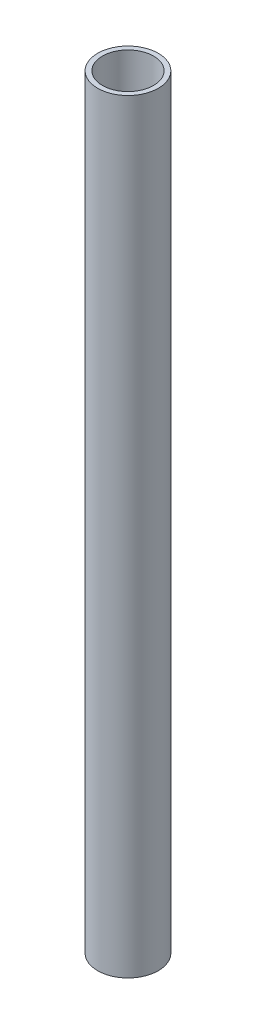
ISO-10303-21;
HEADER;
FILE_DESCRIPTION(('STEP AP214'),'2;1');
FILE_NAME('part.step','',(''),(''),'','','');
FILE_SCHEMA(('AUTOMOTIVE_DESIGN { 1 0 10303 214 1 1 1 1 }'));
ENDSEC;
DATA;
#1=APPLICATION_CONTEXT('core data for automotive mechanical design processes');
#2=APPLICATION_PROTOCOL_DEFINITION('international standard','automotive_design',2000,#1);
#3=PRODUCT_CONTEXT('',#1,'mechanical');
#4=PRODUCT('Part','Part','',(#3));
#5=PRODUCT_RELATED_PRODUCT_CATEGORY('part','',(#4));
#6=PRODUCT_DEFINITION_FORMATION('','',#4);
#7=PRODUCT_DEFINITION_CONTEXT('part definition',#1,'design');
#8=PRODUCT_DEFINITION('design','',#6,#7);
#9=PRODUCT_DEFINITION_SHAPE('','',#8);
#10=(LENGTH_UNIT() NAMED_UNIT(*) SI_UNIT(.MILLI.,.METRE.));
#11=(NAMED_UNIT(*) PLANE_ANGLE_UNIT() SI_UNIT($,.RADIAN.));
#12=(NAMED_UNIT(*) SI_UNIT($,.STERADIAN.) SOLID_ANGLE_UNIT());
#13=UNCERTAINTY_MEASURE_WITH_UNIT(LENGTH_MEASURE(1.E-05),#10,'distance_accuracy_value','');
#14=(GEOMETRIC_REPRESENTATION_CONTEXT(3) GLOBAL_UNCERTAINTY_ASSIGNED_CONTEXT((#13)) GLOBAL_UNIT_ASSIGNED_CONTEXT((#10,
#11,#12)) REPRESENTATION_CONTEXT('',''));
#15=CARTESIAN_POINT('',(0.,0.,0.));
#16=DIRECTION('',(0.,0.,1.));
#17=DIRECTION('',(1.,0.,0.));
#18=AXIS2_PLACEMENT_3D('',#15,#16,#17);
#19=CARTESIAN_POINT('',(0.,320.,0.));
#20=DIRECTION('',(0.,1.,0.));
#21=DIRECTION('',(0.,0.,1.));
#22=AXIS2_PLACEMENT_3D('',#19,#20,#21);
#23=PLANE('',#22);
#24=CARTESIAN_POINT('',(0.,320.,0.));
#25=DIRECTION('',(0.,1.,0.));
#26=DIRECTION('',(0.,0.,1.));
#27=AXIS2_PLACEMENT_3D('',#24,#25,#26);
#28=CIRCLE('',#27,12.7);
#29=CARTESIAN_POINT('',(0.,320.,12.7));
#30=VERTEX_POINT('',#29);
#31=EDGE_CURVE('E10',#30,#30,#28,.T.);
#32=ORIENTED_EDGE('',*,*,#31,.T.);
#33=EDGE_LOOP('',(#32));
#34=FACE_BOUND('',#33,.T.);
#35=CARTESIAN_POINT('',(0.,320.,0.));
#36=DIRECTION('',(0.,1.,0.));
#37=DIRECTION('',(0.,0.,1.));
#38=AXIS2_PLACEMENT_3D('',#35,#36,#37);
#39=CIRCLE('',#38,10.7);
#40=CARTESIAN_POINT('',(0.,320.,10.7));
#41=VERTEX_POINT('',#40);
#42=EDGE_CURVE('E52',#41,#41,#39,.T.);
#43=ORIENTED_EDGE('',*,*,#42,.F.);
#44=EDGE_LOOP('',(#43));
#45=FACE_BOUND('',#44,.T.);
#46=ADVANCED_FACE('F39',(#34,#45),#23,.T.);
#47=CARTESIAN_POINT('',(0.,0.,0.));
#48=DIRECTION('',(0.,1.,0.));
#49=DIRECTION('',(0.,0.,1.));
#50=AXIS2_PLACEMENT_3D('',#47,#48,#49);
#51=PLANE('',#50);
#52=CARTESIAN_POINT('',(0.,0.,0.));
#53=DIRECTION('',(0.,1.,0.));
#54=DIRECTION('',(0.,0.,1.));
#55=AXIS2_PLACEMENT_3D('',#52,#53,#54);
#56=CIRCLE('',#55,12.7);
#57=CARTESIAN_POINT('',(0.,0.,12.7));
#58=VERTEX_POINT('',#57);
#59=EDGE_CURVE('E43',#58,#58,#56,.T.);
#60=ORIENTED_EDGE('',*,*,#59,.F.);
#61=EDGE_LOOP('',(#60));
#62=FACE_BOUND('',#61,.T.);
#63=CARTESIAN_POINT('',(0.,0.,0.));
#64=DIRECTION('',(0.,1.,0.));
#65=DIRECTION('',(0.,0.,1.));
#66=AXIS2_PLACEMENT_3D('',#63,#64,#65);
#67=CIRCLE('',#66,10.7);
#68=CARTESIAN_POINT('',(0.,0.,10.7));
#69=VERTEX_POINT('',#68);
#70=EDGE_CURVE('E54',#69,#69,#67,.T.);
#71=ORIENTED_EDGE('',*,*,#70,.T.);
#72=EDGE_LOOP('',(#71));
#73=FACE_BOUND('',#72,.T.);
#74=ADVANCED_FACE('F66',(#62,#73),#51,.F.);
#75=CARTESIAN_POINT('',(0.,320.,0.));
#76=DIRECTION('',(0.,-1.,0.));
#77=DIRECTION('',(0.,0.,-1.));
#78=AXIS2_PLACEMENT_3D('',#75,#76,#77);
#79=CYLINDRICAL_SURFACE('',#78,12.7);
#80=ORIENTED_EDGE('',*,*,#31,.F.);
#81=EDGE_LOOP('',(#80));
#82=FACE_BOUND('',#81,.T.);
#83=ORIENTED_EDGE('',*,*,#59,.T.);
#84=EDGE_LOOP('',(#83));
#85=FACE_BOUND('',#84,.T.);
#86=ADVANCED_FACE('F41',(#82,#85),#79,.T.);
#87=CARTESIAN_POINT('',(0.,320.,0.));
#88=DIRECTION('',(0.,-1.,0.));
#89=DIRECTION('',(0.,0.,-1.));
#90=AXIS2_PLACEMENT_3D('',#87,#88,#89);
#91=CYLINDRICAL_SURFACE('',#90,10.7);
#92=ORIENTED_EDGE('',*,*,#42,.T.);
#93=EDGE_LOOP('',(#92));
#94=FACE_BOUND('',#93,.T.);
#95=ORIENTED_EDGE('',*,*,#70,.F.);
#96=EDGE_LOOP('',(#95));
#97=FACE_BOUND('',#96,.T.);
#98=ADVANCED_FACE('F62',(#94,#97),#91,.F.);
#99=CLOSED_SHELL('',(#46,#74,#86,#98));
#100=MANIFOLD_SOLID_BREP('B2',#99);
#101=ADVANCED_BREP_SHAPE_REPRESENTATION('',(#18,#100),#14);
#102=SHAPE_DEFINITION_REPRESENTATION(#9,#101);
ENDSEC;
END-ISO-10303-21;
